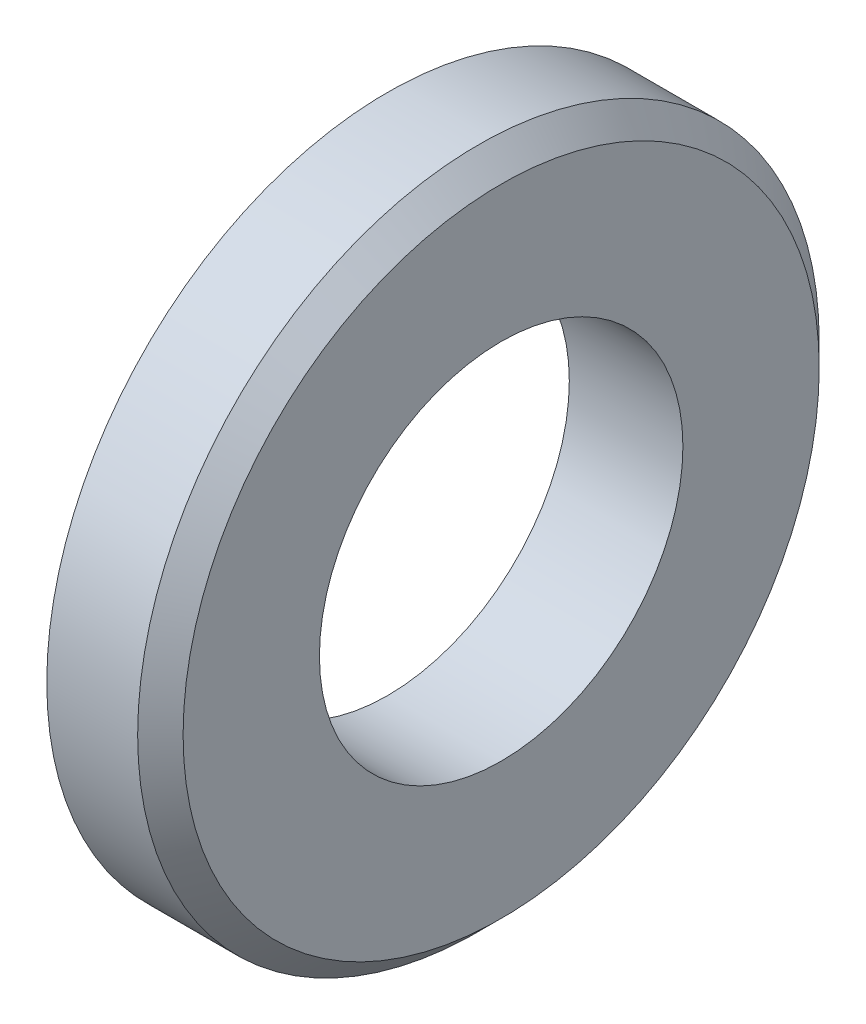
ISO-10303-21;
HEADER;
FILE_DESCRIPTION(('STEP AP214'),'2;1');
FILE_NAME('part.step','',(''),(''),'','','');
FILE_SCHEMA(('AUTOMOTIVE_DESIGN { 1 0 10303 214 1 1 1 1 }'));
ENDSEC;
DATA;
#1=APPLICATION_CONTEXT('core data for automotive mechanical design processes');
#2=APPLICATION_PROTOCOL_DEFINITION('international standard','automotive_design',2000,#1);
#3=PRODUCT_CONTEXT('',#1,'mechanical');
#4=PRODUCT('Part','Part','',(#3));
#5=PRODUCT_RELATED_PRODUCT_CATEGORY('part','',(#4));
#6=PRODUCT_DEFINITION_FORMATION('','',#4);
#7=PRODUCT_DEFINITION_CONTEXT('part definition',#1,'design');
#8=PRODUCT_DEFINITION('design','',#6,#7);
#9=PRODUCT_DEFINITION_SHAPE('','',#8);
#10=(LENGTH_UNIT() NAMED_UNIT(*) SI_UNIT(.MILLI.,.METRE.));
#11=(NAMED_UNIT(*) PLANE_ANGLE_UNIT() SI_UNIT($,.RADIAN.));
#12=(NAMED_UNIT(*) SI_UNIT($,.STERADIAN.) SOLID_ANGLE_UNIT());
#13=UNCERTAINTY_MEASURE_WITH_UNIT(LENGTH_MEASURE(1.E-05),#10,'distance_accuracy_value','');
#14=(GEOMETRIC_REPRESENTATION_CONTEXT(3) GLOBAL_UNCERTAINTY_ASSIGNED_CONTEXT((#13)) GLOBAL_UNIT_ASSIGNED_CONTEXT((#10,
#11,#12)) REPRESENTATION_CONTEXT('',''));
#15=CARTESIAN_POINT('',(0.,0.,0.));
#16=DIRECTION('',(0.,0.,1.));
#17=DIRECTION('',(1.,0.,0.));
#18=AXIS2_PLACEMENT_3D('',#15,#16,#17);
#19=CARTESIAN_POINT('',(10.,0.,0.));
#20=DIRECTION('',(-1.,0.,0.));
#21=DIRECTION('',(0.,0.,1.));
#22=AXIS2_PLACEMENT_3D('',#19,#20,#21);
#23=CYLINDRICAL_SURFACE('',#22,30.);
#24=CARTESIAN_POINT('',(7.99999999999999,0.,0.));
#25=DIRECTION('',(1.,0.,0.));
#26=DIRECTION('',(0.,0.,-1.));
#27=AXIS2_PLACEMENT_3D('',#24,#25,#26);
#28=CIRCLE('',#27,30.);
#29=CARTESIAN_POINT('',(7.99999999999999,0.,-30.));
#30=VERTEX_POINT('',#29);
#31=EDGE_CURVE('E10',#30,#30,#28,.F.);
#32=ORIENTED_EDGE('',*,*,#31,.T.);
#33=EDGE_LOOP('',(#32));
#34=FACE_BOUND('',#33,.T.);
#35=CARTESIAN_POINT('',(0.,0.,0.));
#36=DIRECTION('',(1.,0.,0.));
#37=DIRECTION('',(0.,0.,-1.));
#38=AXIS2_PLACEMENT_3D('',#35,#36,#37);
#39=CIRCLE('',#38,30.);
#40=CARTESIAN_POINT('',(0.,0.,-30.));
#41=VERTEX_POINT('',#40);
#42=EDGE_CURVE('E63',#41,#41,#39,.T.);
#43=ORIENTED_EDGE('',*,*,#42,.T.);
#44=EDGE_LOOP('',(#43));
#45=FACE_BOUND('',#44,.T.);
#46=ADVANCED_FACE('F47',(#34,#45),#23,.T.);
#47=CARTESIAN_POINT('',(10.,0.,0.));
#48=DIRECTION('',(1.,0.,0.));
#49=DIRECTION('',(0.,0.,-1.));
#50=AXIS2_PLACEMENT_3D('',#47,#48,#49);
#51=PLANE('',#50);
#52=CARTESIAN_POINT('',(10.,0.,0.));
#53=DIRECTION('',(1.,0.,0.));
#54=DIRECTION('',(0.,0.,-1.));
#55=AXIS2_PLACEMENT_3D('',#52,#53,#54);
#56=CIRCLE('',#55,16.);
#57=CARTESIAN_POINT('',(10.,0.,-16.));
#58=VERTEX_POINT('',#57);
#59=EDGE_CURVE('E73',#58,#58,#56,.T.);
#60=ORIENTED_EDGE('',*,*,#59,.F.);
#61=EDGE_LOOP('',(#60));
#62=FACE_BOUND('',#61,.T.);
#63=CARTESIAN_POINT('',(10.,0.,0.));
#64=DIRECTION('',(1.,0.,0.));
#65=DIRECTION('',(0.,0.,-1.));
#66=AXIS2_PLACEMENT_3D('',#63,#64,#65);
#67=CIRCLE('',#66,28.);
#68=CARTESIAN_POINT('',(10.,0.,-28.));
#69=VERTEX_POINT('',#68);
#70=EDGE_CURVE('E56',#69,#69,#67,.T.);
#71=ORIENTED_EDGE('',*,*,#70,.T.);
#72=EDGE_LOOP('',(#71));
#73=FACE_BOUND('',#72,.T.);
#74=ADVANCED_FACE('F92',(#62,#73),#51,.T.);
#75=CARTESIAN_POINT('',(0.,0.,0.));
#76=DIRECTION('',(1.,0.,0.));
#77=DIRECTION('',(0.,0.,-1.));
#78=AXIS2_PLACEMENT_3D('',#75,#76,#77);
#79=PLANE('',#78);
#80=CARTESIAN_POINT('',(0.,0.,0.));
#81=DIRECTION('',(1.,0.,0.));
#82=DIRECTION('',(0.,0.,-1.));
#83=AXIS2_PLACEMENT_3D('',#80,#81,#82);
#84=CIRCLE('',#83,16.);
#85=CARTESIAN_POINT('',(0.,0.,-16.));
#86=VERTEX_POINT('',#85);
#87=EDGE_CURVE('E70',#86,#86,#84,.T.);
#88=ORIENTED_EDGE('',*,*,#87,.T.);
#89=EDGE_LOOP('',(#88));
#90=FACE_BOUND('',#89,.T.);
#91=ORIENTED_EDGE('',*,*,#42,.F.);
#92=EDGE_LOOP('',(#91));
#93=FACE_BOUND('',#92,.T.);
#94=ADVANCED_FACE('F83',(#90,#93),#79,.F.);
#95=CARTESIAN_POINT('',(10.,0.,0.));
#96=DIRECTION('',(-1.,0.,0.));
#97=DIRECTION('',(0.,0.,1.));
#98=AXIS2_PLACEMENT_3D('',#95,#96,#97);
#99=CONICAL_SURFACE('',#98,28.,0.78539816339745);
#100=ORIENTED_EDGE('',*,*,#31,.F.);
#101=EDGE_LOOP('',(#100));
#102=FACE_BOUND('',#101,.T.);
#103=ORIENTED_EDGE('',*,*,#70,.F.);
#104=EDGE_LOOP('',(#103));
#105=FACE_BOUND('',#104,.T.);
#106=ADVANCED_FACE('F50',(#102,#105),#99,.T.);
#107=CARTESIAN_POINT('',(0.,0.,0.));
#108=DIRECTION('',(1.,0.,0.));
#109=DIRECTION('',(0.,0.,-1.));
#110=AXIS2_PLACEMENT_3D('',#107,#108,#109);
#111=CYLINDRICAL_SURFACE('',#110,16.);
#112=ORIENTED_EDGE('',*,*,#87,.F.);
#113=EDGE_LOOP('',(#112));
#114=FACE_BOUND('',#113,.T.);
#115=ORIENTED_EDGE('',*,*,#59,.T.);
#116=EDGE_LOOP('',(#115));
#117=FACE_BOUND('',#116,.T.);
#118=ADVANCED_FACE('F86',(#114,#117),#111,.F.);
#119=CLOSED_SHELL('',(#46,#74,#94,#106,#118));
#120=MANIFOLD_SOLID_BREP('B2',#119);
#121=ADVANCED_BREP_SHAPE_REPRESENTATION('',(#18,#120),#14);
#122=SHAPE_DEFINITION_REPRESENTATION(#9,#121);
ENDSEC;
END-ISO-10303-21;
